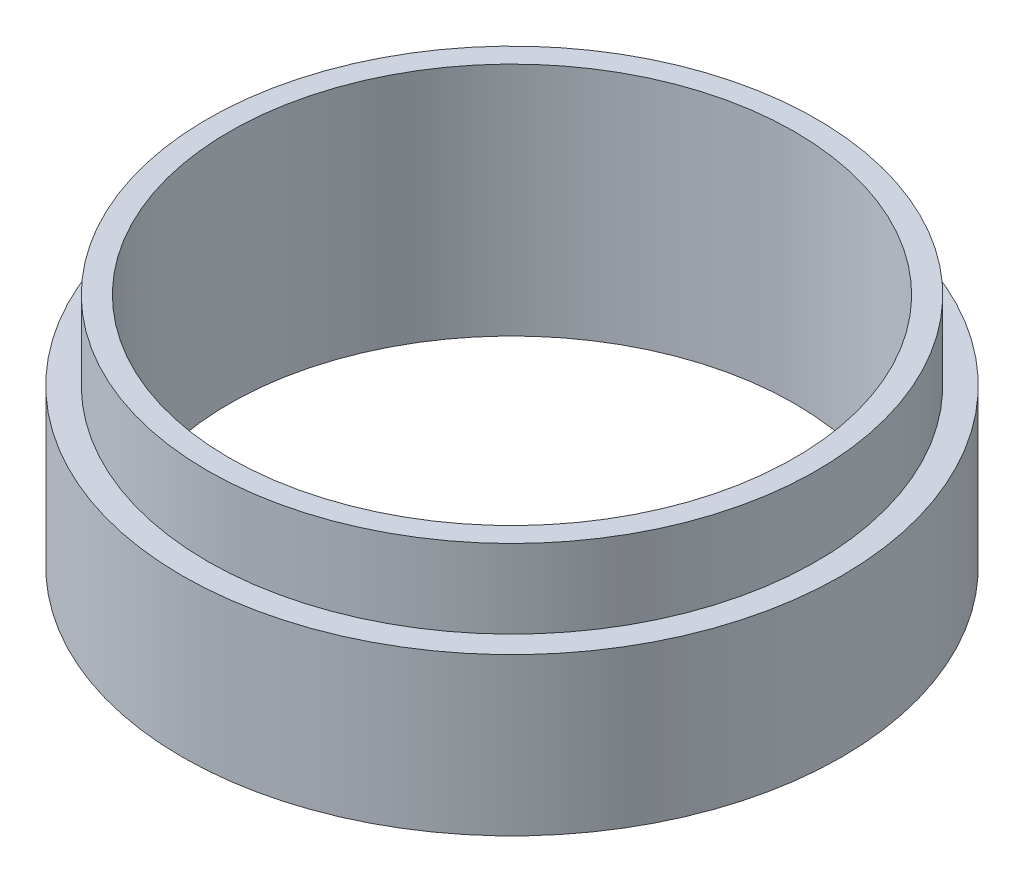
ISO-10303-21;
HEADER;
FILE_DESCRIPTION(('STEP AP214'),'2;1');
FILE_NAME('part.step','',(''),(''),'','','');
FILE_SCHEMA(('AUTOMOTIVE_DESIGN { 1 0 10303 214 1 1 1 1 }'));
ENDSEC;
DATA;
#1=APPLICATION_CONTEXT('core data for automotive mechanical design processes');
#2=APPLICATION_PROTOCOL_DEFINITION('international standard','automotive_design',2000,#1);
#3=PRODUCT_CONTEXT('',#1,'mechanical');
#4=PRODUCT('Part','Part','',(#3));
#5=PRODUCT_RELATED_PRODUCT_CATEGORY('part','',(#4));
#6=PRODUCT_DEFINITION_FORMATION('','',#4);
#7=PRODUCT_DEFINITION_CONTEXT('part definition',#1,'design');
#8=PRODUCT_DEFINITION('design','',#6,#7);
#9=PRODUCT_DEFINITION_SHAPE('','',#8);
#10=(LENGTH_UNIT() NAMED_UNIT(*) SI_UNIT(.MILLI.,.METRE.));
#11=(NAMED_UNIT(*) PLANE_ANGLE_UNIT() SI_UNIT($,.RADIAN.));
#12=(NAMED_UNIT(*) SI_UNIT($,.STERADIAN.) SOLID_ANGLE_UNIT());
#13=UNCERTAINTY_MEASURE_WITH_UNIT(LENGTH_MEASURE(1.E-05),#10,'distance_accuracy_value','');
#14=(GEOMETRIC_REPRESENTATION_CONTEXT(3) GLOBAL_UNCERTAINTY_ASSIGNED_CONTEXT((#13)) GLOBAL_UNIT_ASSIGNED_CONTEXT((#10,
#11,#12)) REPRESENTATION_CONTEXT('',''));
#15=CARTESIAN_POINT('',(0.,0.,0.));
#16=DIRECTION('',(0.,0.,1.));
#17=DIRECTION('',(1.,0.,0.));
#18=AXIS2_PLACEMENT_3D('',#15,#16,#17);
#19=CARTESIAN_POINT('',(0.,0.,0.));
#20=DIRECTION('',(0.,-1.,0.));
#21=DIRECTION('',(0.,0.,-1.));
#22=AXIS2_PLACEMENT_3D('',#19,#20,#21);
#23=CYLINDRICAL_SURFACE('',#22,21.);
#24=CARTESIAN_POINT('',(0.,10.,0.));
#25=DIRECTION('',(0.,-1.,0.));
#26=DIRECTION('',(0.,0.,-1.));
#27=AXIS2_PLACEMENT_3D('',#24,#25,#26);
#28=CIRCLE('',#27,21.);
#29=CARTESIAN_POINT('',(0.,10.,-21.));
#30=VERTEX_POINT('',#29);
#31=EDGE_CURVE('E39',#30,#30,#28,.T.);
#32=ORIENTED_EDGE('',*,*,#31,.T.);
#33=EDGE_LOOP('',(#32));
#34=FACE_BOUND('',#33,.T.);
#35=CARTESIAN_POINT('',(0.,0.,0.));
#36=DIRECTION('',(0.,-1.,0.));
#37=DIRECTION('',(0.,0.,-1.));
#38=AXIS2_PLACEMENT_3D('',#35,#36,#37);
#39=CIRCLE('',#38,21.);
#40=CARTESIAN_POINT('',(0.,0.,-21.));
#41=VERTEX_POINT('',#40);
#42=EDGE_CURVE('E50',#41,#41,#39,.T.);
#43=ORIENTED_EDGE('',*,*,#42,.F.);
#44=EDGE_LOOP('',(#43));
#45=FACE_BOUND('',#44,.T.);
#46=ADVANCED_FACE('F38',(#34,#45),#23,.T.);
#47=CARTESIAN_POINT('',(0.,10.,0.));
#48=DIRECTION('',(0.,1.,0.));
#49=DIRECTION('',(0.,0.,1.));
#50=AXIS2_PLACEMENT_3D('',#47,#48,#49);
#51=PLANE('',#50);
#52=CARTESIAN_POINT('',(0.,10.,0.));
#53=DIRECTION('',(0.,1.,0.));
#54=DIRECTION('',(0.,0.,1.));
#55=AXIS2_PLACEMENT_3D('',#52,#53,#54);
#56=CIRCLE('',#55,19.4);
#57=CARTESIAN_POINT('',(0.,10.,19.4));
#58=VERTEX_POINT('',#57);
#59=EDGE_CURVE('E10',#58,#58,#56,.T.);
#60=ORIENTED_EDGE('',*,*,#59,.F.);
#61=EDGE_LOOP('',(#60));
#62=FACE_BOUND('',#61,.T.);
#63=ORIENTED_EDGE('',*,*,#31,.F.);
#64=EDGE_LOOP('',(#63));
#65=FACE_BOUND('',#64,.T.);
#66=ADVANCED_FACE('F58',(#62,#65),#51,.T.);
#67=CARTESIAN_POINT('',(0.,0.,0.));
#68=DIRECTION('',(0.,-1.,0.));
#69=DIRECTION('',(0.,0.,-1.));
#70=AXIS2_PLACEMENT_3D('',#67,#68,#69);
#71=PLANE('',#70);
#72=CARTESIAN_POINT('',(0.,0.,0.));
#73=DIRECTION('',(0.,1.,0.));
#74=DIRECTION('',(0.,0.,1.));
#75=AXIS2_PLACEMENT_3D('',#72,#73,#74);
#76=CIRCLE('',#75,18.);
#77=CARTESIAN_POINT('',(0.,0.,18.));
#78=VERTEX_POINT('',#77);
#79=EDGE_CURVE('E55',#78,#78,#76,.T.);
#80=ORIENTED_EDGE('',*,*,#79,.T.);
#81=EDGE_LOOP('',(#80));
#82=FACE_BOUND('',#81,.T.);
#83=ORIENTED_EDGE('',*,*,#42,.T.);
#84=EDGE_LOOP('',(#83));
#85=FACE_BOUND('',#84,.T.);
#86=ADVANCED_FACE('F60',(#82,#85),#71,.T.);
#87=CARTESIAN_POINT('',(0.,0.,0.));
#88=DIRECTION('',(0.,1.,0.));
#89=DIRECTION('',(0.,0.,1.));
#90=AXIS2_PLACEMENT_3D('',#87,#88,#89);
#91=CYLINDRICAL_SURFACE('',#90,18.);
#92=ORIENTED_EDGE('',*,*,#79,.F.);
#93=EDGE_LOOP('',(#92));
#94=FACE_BOUND('',#93,.T.);
#95=CARTESIAN_POINT('',(0.,15.,0.));
#96=DIRECTION('',(0.,1.,0.));
#97=DIRECTION('',(0.,0.,1.));
#98=AXIS2_PLACEMENT_3D('',#95,#96,#97);
#99=CIRCLE('',#98,18.);
#100=CARTESIAN_POINT('',(0.,15.,18.));
#101=VERTEX_POINT('',#100);
#102=EDGE_CURVE('E89',#101,#101,#99,.T.);
#103=ORIENTED_EDGE('',*,*,#102,.T.);
#104=EDGE_LOOP('',(#103));
#105=FACE_BOUND('',#104,.T.);
#106=ADVANCED_FACE('F75',(#94,#105),#91,.F.);
#107=CARTESIAN_POINT('',(0.,15.,0.));
#108=DIRECTION('',(0.,1.,0.));
#109=DIRECTION('',(0.,0.,1.));
#110=AXIS2_PLACEMENT_3D('',#107,#108,#109);
#111=PLANE('',#110);
#112=ORIENTED_EDGE('',*,*,#102,.F.);
#113=EDGE_LOOP('',(#112));
#114=FACE_BOUND('',#113,.T.);
#115=CARTESIAN_POINT('',(0.,15.,0.));
#116=DIRECTION('',(0.,1.,0.));
#117=DIRECTION('',(0.,0.,1.));
#118=AXIS2_PLACEMENT_3D('',#115,#116,#117);
#119=CIRCLE('',#118,19.4);
#120=CARTESIAN_POINT('',(0.,15.,19.4));
#121=VERTEX_POINT('',#120);
#122=EDGE_CURVE('E49',#121,#121,#119,.T.);
#123=ORIENTED_EDGE('',*,*,#122,.T.);
#124=EDGE_LOOP('',(#123));
#125=FACE_BOUND('',#124,.T.);
#126=ADVANCED_FACE('F77',(#114,#125),#111,.T.);
#127=CARTESIAN_POINT('',(0.,15.,0.));
#128=DIRECTION('',(0.,-1.,0.));
#129=DIRECTION('',(0.,0.,-1.));
#130=AXIS2_PLACEMENT_3D('',#127,#128,#129);
#131=CYLINDRICAL_SURFACE('',#130,19.4);
#132=ORIENTED_EDGE('',*,*,#122,.F.);
#133=EDGE_LOOP('',(#132));
#134=FACE_BOUND('',#133,.T.);
#135=ORIENTED_EDGE('',*,*,#59,.T.);
#136=EDGE_LOOP('',(#135));
#137=FACE_BOUND('',#136,.T.);
#138=ADVANCED_FACE('F79',(#134,#137),#131,.T.);
#139=CLOSED_SHELL('',(#46,#66,#86,#106,#126,#138));
#140=MANIFOLD_SOLID_BREP('B2',#139);
#141=ADVANCED_BREP_SHAPE_REPRESENTATION('',(#18,#140),#14);
#142=SHAPE_DEFINITION_REPRESENTATION(#9,#141);
ENDSEC;
END-ISO-10303-21;
